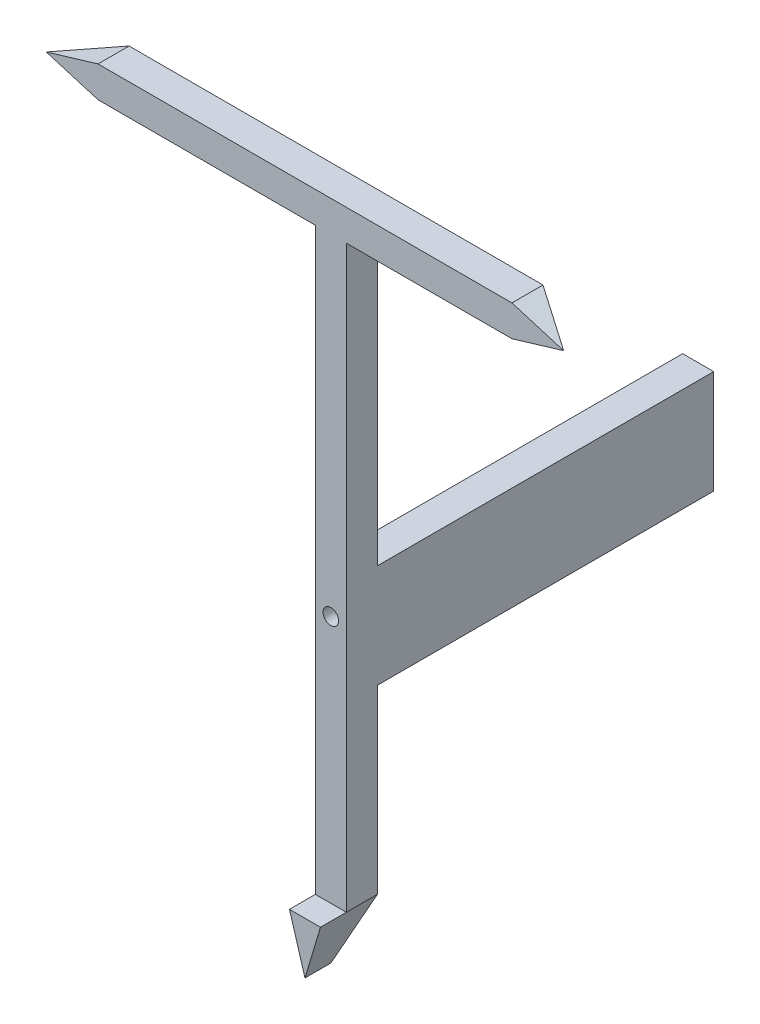
ISO-10303-21;
HEADER;
FILE_DESCRIPTION(('STEP AP214'),'2;1');
FILE_NAME('part.step','',(''),(''),'','','');
FILE_SCHEMA(('AUTOMOTIVE_DESIGN { 1 0 10303 214 1 1 1 1 }'));
ENDSEC;
DATA;
#1=APPLICATION_CONTEXT('core data for automotive mechanical design processes');
#2=APPLICATION_PROTOCOL_DEFINITION('international standard','automotive_design',2000,#1);
#3=PRODUCT_CONTEXT('',#1,'mechanical');
#4=PRODUCT('Part','Part','',(#3));
#5=PRODUCT_RELATED_PRODUCT_CATEGORY('part','',(#4));
#6=PRODUCT_DEFINITION_FORMATION('','',#4);
#7=PRODUCT_DEFINITION_CONTEXT('part definition',#1,'design');
#8=PRODUCT_DEFINITION('design','',#6,#7);
#9=PRODUCT_DEFINITION_SHAPE('','',#8);
#10=(LENGTH_UNIT() NAMED_UNIT(*) SI_UNIT(.MILLI.,.METRE.));
#11=(NAMED_UNIT(*) PLANE_ANGLE_UNIT() SI_UNIT($,.RADIAN.));
#12=(NAMED_UNIT(*) SI_UNIT($,.STERADIAN.) SOLID_ANGLE_UNIT());
#13=UNCERTAINTY_MEASURE_WITH_UNIT(LENGTH_MEASURE(1.E-05),#10,'distance_accuracy_value','');
#14=(GEOMETRIC_REPRESENTATION_CONTEXT(3) GLOBAL_UNCERTAINTY_ASSIGNED_CONTEXT((#13)) GLOBAL_UNIT_ASSIGNED_CONTEXT((#10,
#11,#12)) REPRESENTATION_CONTEXT('',''));
#15=CARTESIAN_POINT('',(0.,0.,0.));
#16=DIRECTION('',(0.,0.,1.));
#17=DIRECTION('',(1.,0.,0.));
#18=AXIS2_PLACEMENT_3D('',#15,#16,#17);
#19=CARTESIAN_POINT('',(0.,0.,-7.62));
#20=DIRECTION('',(0.,0.,-1.));
#21=DIRECTION('',(-1.,0.,0.));
#22=AXIS2_PLACEMENT_3D('',#19,#20,#21);
#23=PLANE('',#22);
#24=DIRECTION('',(0.,1.,0.));
#25=VECTOR('',#24,1.);
#26=CARTESIAN_POINT('',(10.16,-146.05,-7.62));
#27=LINE('',#26,#25);
#28=CARTESIAN_POINT('',(10.16,-76.2,-7.62));
#29=VERTEX_POINT('',#28);
#30=CARTESIAN_POINT('',(10.16,-3.81000000000001,-7.62));
#31=VERTEX_POINT('',#30);
#32=EDGE_CURVE('E120',#29,#31,#27,.T.);
#33=ORIENTED_EDGE('',*,*,#32,.F.);
#34=DIRECTION('',(-1.,0.,0.));
#35=VECTOR('',#34,1.);
#36=CARTESIAN_POINT('',(96.5293377304701,-76.2,-7.62));
#37=LINE('',#36,#35);
#38=CARTESIAN_POINT('',(2.54000000000001,-76.2,-7.62));
#39=VERTEX_POINT('',#38);
#40=EDGE_CURVE('E372',#29,#39,#37,.T.);
#41=ORIENTED_EDGE('',*,*,#40,.T.);
#42=DIRECTION('',(0.,-1.,0.));
#43=VECTOR('',#42,1.);
#44=CARTESIAN_POINT('',(2.54000000000001,-146.05,-7.62));
#45=LINE('',#44,#43);
#46=CARTESIAN_POINT('',(2.54000000000001,-3.81000000000001,-7.62));
#47=VERTEX_POINT('',#46);
#48=EDGE_CURVE('E134',#47,#39,#45,.T.);
#49=ORIENTED_EDGE('',*,*,#48,.F.);
#50=DIRECTION('',(1.,0.,0.));
#51=VECTOR('',#50,1.);
#52=CARTESIAN_POINT('',(2.54000000000001,-3.81000000000001,-7.62));
#53=LINE('',#52,#51);
#54=CARTESIAN_POINT('',(-50.8,-3.81000000000001,-7.62));
#55=VERTEX_POINT('',#54);
#56=EDGE_CURVE('E193',#55,#47,#53,.T.);
#57=ORIENTED_EDGE('',*,*,#56,.F.);
#58=DIRECTION('',(0.,1.,0.));
#59=VECTOR('',#58,1.);
#60=CARTESIAN_POINT('',(-50.8,-158.75,-7.62));
#61=LINE('',#60,#59);
#62=CARTESIAN_POINT('',(-50.8,3.80999999999999,-7.62));
#63=VERTEX_POINT('',#62);
#64=EDGE_CURVE('E307',#55,#63,#61,.T.);
#65=ORIENTED_EDGE('',*,*,#64,.T.);
#66=DIRECTION('',(-1.,0.,0.));
#67=VECTOR('',#66,1.);
#68=CARTESIAN_POINT('',(-50.8,3.80999999999999,-7.62));
#69=LINE('',#68,#67);
#70=CARTESIAN_POINT('',(50.8,3.80999999999999,-7.62));
#71=VERTEX_POINT('',#70);
#72=EDGE_CURVE('E153',#71,#63,#69,.T.);
#73=ORIENTED_EDGE('',*,*,#72,.F.);
#74=DIRECTION('',(0.,1.,0.));
#75=VECTOR('',#74,1.);
#76=CARTESIAN_POINT('',(50.8,-158.75,-7.62));
#77=LINE('',#76,#75);
#78=CARTESIAN_POINT('',(50.8,-3.81,-7.62));
#79=VERTEX_POINT('',#78);
#80=EDGE_CURVE('E150',#79,#71,#77,.T.);
#81=ORIENTED_EDGE('',*,*,#80,.F.);
#82=DIRECTION('',(1.,0.,0.));
#83=VECTOR('',#82,1.);
#84=CARTESIAN_POINT('',(50.8,-3.81,-7.62));
#85=LINE('',#84,#83);
#86=EDGE_CURVE('E139',#31,#79,#85,.T.);
#87=ORIENTED_EDGE('',*,*,#86,.F.);
#88=EDGE_LOOP('',(#33,#41,#49,#57,#65,#73,#81,#87));
#89=FACE_BOUND('',#88,.T.);
#90=ADVANCED_FACE('F45',(#89),#23,.T.);
#91=CARTESIAN_POINT('',(0.,0.,0.));
#92=DIRECTION('',(0.,0.,-1.));
#93=DIRECTION('',(-1.,0.,0.));
#94=AXIS2_PLACEMENT_3D('',#91,#92,#93);
#95=PLANE('',#94);
#96=CARTESIAN_POINT('',(6.35000000000001,-85.09,0.));
#97=DIRECTION('',(0.,0.,1.));
#98=DIRECTION('',(1.,0.,0.));
#99=AXIS2_PLACEMENT_3D('',#96,#97,#98);
#100=CIRCLE('',#99,1.905);
#101=CARTESIAN_POINT('',(8.25500000000001,-85.09,0.));
#102=VERTEX_POINT('',#101);
#103=EDGE_CURVE('E166',#102,#102,#100,.T.);
#104=ORIENTED_EDGE('',*,*,#103,.F.);
#105=EDGE_LOOP('',(#104));
#106=FACE_BOUND('',#105,.T.);
#107=DIRECTION('',(-1.,0.,0.));
#108=VECTOR('',#107,1.);
#109=CARTESIAN_POINT('',(2.54000000000001,-146.05,0.));
#110=LINE('',#109,#108);
#111=CARTESIAN_POINT('',(10.16,-146.05,0.));
#112=VERTEX_POINT('',#111);
#113=CARTESIAN_POINT('',(2.54000000000001,-146.05,0.));
#114=VERTEX_POINT('',#113);
#115=EDGE_CURVE('E301',#112,#114,#110,.T.);
#116=ORIENTED_EDGE('',*,*,#115,.F.);
#117=DIRECTION('',(0.,1.,0.));
#118=VECTOR('',#117,1.);
#119=CARTESIAN_POINT('',(10.16,-146.05,0.));
#120=LINE('',#119,#118);
#121=CARTESIAN_POINT('',(10.16,-3.81000000000001,0.));
#122=VERTEX_POINT('',#121);
#123=EDGE_CURVE('E174',#112,#122,#120,.T.);
#124=ORIENTED_EDGE('',*,*,#123,.T.);
#125=DIRECTION('',(1.,0.,0.));
#126=VECTOR('',#125,1.);
#127=CARTESIAN_POINT('',(50.8,-3.81,0.));
#128=LINE('',#127,#126);
#129=CARTESIAN_POINT('',(50.8,-3.81,0.));
#130=VERTEX_POINT('',#129);
#131=EDGE_CURVE('E141',#122,#130,#128,.T.);
#132=ORIENTED_EDGE('',*,*,#131,.T.);
#133=DIRECTION('',(0.957826285221151,0.287347885566347,0.));
#134=VECTOR('',#133,1.);
#135=CARTESIAN_POINT('',(63.5,0.,0.));
#136=LINE('',#135,#134);
#137=CARTESIAN_POINT('',(63.5,0.,0.));
#138=VERTEX_POINT('',#137);
#139=EDGE_CURVE('E179',#130,#138,#136,.T.);
#140=ORIENTED_EDGE('',*,*,#139,.T.);
#141=DIRECTION('',(-0.957826285221152,0.287347885566343,0.));
#142=VECTOR('',#141,1.);
#143=CARTESIAN_POINT('',(50.8,3.80999999999999,0.));
#144=LINE('',#143,#142);
#145=CARTESIAN_POINT('',(50.8,3.80999999999999,0.));
#146=VERTEX_POINT('',#145);
#147=EDGE_CURVE('E183',#138,#146,#144,.T.);
#148=ORIENTED_EDGE('',*,*,#147,.T.);
#149=DIRECTION('',(-1.,0.,0.));
#150=VECTOR('',#149,1.);
#151=CARTESIAN_POINT('',(-50.8,3.80999999999999,0.));
#152=LINE('',#151,#150);
#153=CARTESIAN_POINT('',(-50.8,3.80999999999999,0.));
#154=VERTEX_POINT('',#153);
#155=EDGE_CURVE('E187',#146,#154,#152,.T.);
#156=ORIENTED_EDGE('',*,*,#155,.T.);
#157=DIRECTION('',(-0.957826285221152,-0.287347885566344,0.));
#158=VECTOR('',#157,1.);
#159=CARTESIAN_POINT('',(-63.5,0.,0.));
#160=LINE('',#159,#158);
#161=CARTESIAN_POINT('',(-63.5,0.,0.));
#162=VERTEX_POINT('',#161);
#163=EDGE_CURVE('E190',#154,#162,#160,.T.);
#164=ORIENTED_EDGE('',*,*,#163,.T.);
#165=DIRECTION('',(0.957826285221151,-0.287347885566346,0.));
#166=VECTOR('',#165,1.);
#167=CARTESIAN_POINT('',(-50.8,-3.81000000000001,0.));
#168=LINE('',#167,#166);
#169=CARTESIAN_POINT('',(-50.8,-3.81000000000001,0.));
#170=VERTEX_POINT('',#169);
#171=EDGE_CURVE('E161',#162,#170,#168,.T.);
#172=ORIENTED_EDGE('',*,*,#171,.T.);
#173=DIRECTION('',(1.,0.,0.));
#174=VECTOR('',#173,1.);
#175=CARTESIAN_POINT('',(2.54000000000001,-3.81000000000001,0.));
#176=LINE('',#175,#174);
#177=CARTESIAN_POINT('',(2.54000000000001,-3.81000000000001,0.));
#178=VERTEX_POINT('',#177);
#179=EDGE_CURVE('E165',#170,#178,#176,.T.);
#180=ORIENTED_EDGE('',*,*,#179,.T.);
#181=DIRECTION('',(0.,-1.,0.));
#182=VECTOR('',#181,1.);
#183=CARTESIAN_POINT('',(2.54000000000001,-146.05,0.));
#184=LINE('',#183,#182);
#185=EDGE_CURVE('E170',#178,#114,#184,.T.);
#186=ORIENTED_EDGE('',*,*,#185,.T.);
#187=EDGE_LOOP('',(#116,#124,#132,#140,#148,#156,#164,#172,#180,#186));
#188=FACE_BOUND('',#187,.T.);
#189=ADVANCED_FACE('F219',(#106,#188),#95,.F.);
#190=CARTESIAN_POINT('',(-50.8,-3.81000000000001,-7.62));
#191=DIRECTION('',(-0.287347885566346,-0.957826285221151,0.));
#192=DIRECTION('',(0.957826285221151,-0.287347885566346,0.));
#193=AXIS2_PLACEMENT_3D('',#190,#191,#192);
#194=PLANE('',#193);
#195=DIRECTION('',(-0.8304547985374,0.249136439561221,0.49827287912244));
#196=VECTOR('',#195,1.);
#197=CARTESIAN_POINT('',(-50.8,-3.81000000000001,-7.62));
#198=LINE('',#197,#196);
#199=EDGE_CURVE('E215',#55,#162,#198,.T.);
#200=ORIENTED_EDGE('',*,*,#199,.F.);
#201=DIRECTION('',(0.,0.,1.));
#202=VECTOR('',#201,1.);
#203=CARTESIAN_POINT('',(-50.8,-3.81000000000001,-7.62));
#204=LINE('',#203,#202);
#205=EDGE_CURVE('E49',#55,#170,#204,.T.);
#206=ORIENTED_EDGE('',*,*,#205,.T.);
#207=ORIENTED_EDGE('',*,*,#171,.F.);
#208=EDGE_LOOP('',(#200,#206,#207));
#209=FACE_BOUND('',#208,.T.);
#210=ADVANCED_FACE('F47',(#209),#194,.T.);
#211=CARTESIAN_POINT('',(-63.5,0.,-7.62));
#212=DIRECTION('',(-0.287347885566344,0.957826285221152,0.));
#213=DIRECTION('',(-0.957826285221152,-0.287347885566344,0.));
#214=AXIS2_PLACEMENT_3D('',#211,#212,#213);
#215=PLANE('',#214);
#216=DIRECTION('',(0.8304547985374,0.249136439561219,-0.49827287912244));
#217=VECTOR('',#216,1.);
#218=CARTESIAN_POINT('',(-60.3468965517241,0.945931034482755,-1.89186206896552));
#219=LINE('',#218,#217);
#220=EDGE_CURVE('E72',#162,#63,#219,.T.);
#221=ORIENTED_EDGE('',*,*,#220,.F.);
#222=ORIENTED_EDGE('',*,*,#163,.F.);
#223=DIRECTION('',(0.,0.,1.));
#224=VECTOR('',#223,1.);
#225=CARTESIAN_POINT('',(-50.8,3.80999999999999,-7.62));
#226=LINE('',#225,#224);
#227=EDGE_CURVE('E11',#63,#154,#226,.T.);
#228=ORIENTED_EDGE('',*,*,#227,.F.);
#229=EDGE_LOOP('',(#221,#222,#228));
#230=FACE_BOUND('',#229,.T.);
#231=ADVANCED_FACE('F223',(#230),#215,.T.);
#232=CARTESIAN_POINT('',(-50.8,3.80999999999999,-7.62));
#233=DIRECTION('',(0.,1.,0.));
#234=DIRECTION('',(-1.,0.,0.));
#235=AXIS2_PLACEMENT_3D('',#232,#233,#234);
#236=PLANE('',#235);
#237=ORIENTED_EDGE('',*,*,#155,.F.);
#238=DIRECTION('',(0.,0.,1.));
#239=VECTOR('',#238,1.);
#240=CARTESIAN_POINT('',(50.8,3.80999999999999,-7.62));
#241=LINE('',#240,#239);
#242=EDGE_CURVE('E55',#71,#146,#241,.T.);
#243=ORIENTED_EDGE('',*,*,#242,.F.);
#244=ORIENTED_EDGE('',*,*,#72,.T.);
#245=ORIENTED_EDGE('',*,*,#227,.T.);
#246=EDGE_LOOP('',(#237,#243,#244,#245));
#247=FACE_BOUND('',#246,.T.);
#248=ADVANCED_FACE('F438',(#247),#236,.T.);
#249=CARTESIAN_POINT('',(50.8,3.80999999999999,-7.62));
#250=DIRECTION('',(0.287347885566343,0.957826285221152,0.));
#251=DIRECTION('',(-0.957826285221152,0.287347885566343,0.));
#252=AXIS2_PLACEMENT_3D('',#249,#250,#251);
#253=PLANE('',#252);
#254=DIRECTION('',(0.8304547985374,-0.249136439561218,0.49827287912244));
#255=VECTOR('',#254,1.);
#256=CARTESIAN_POINT('',(50.8,3.80999999999999,-7.62));
#257=LINE('',#256,#255);
#258=EDGE_CURVE('E225',#71,#138,#257,.T.);
#259=ORIENTED_EDGE('',*,*,#258,.F.);
#260=ORIENTED_EDGE('',*,*,#242,.T.);
#261=ORIENTED_EDGE('',*,*,#147,.F.);
#262=EDGE_LOOP('',(#259,#260,#261));
#263=FACE_BOUND('',#262,.T.);
#264=ADVANCED_FACE('F323',(#263),#253,.T.);
#265=CARTESIAN_POINT('',(63.5,0.,-7.62));
#266=DIRECTION('',(0.287347885566347,-0.957826285221151,0.));
#267=DIRECTION('',(0.957826285221151,0.287347885566347,0.));
#268=AXIS2_PLACEMENT_3D('',#265,#266,#267);
#269=PLANE('',#268);
#270=DIRECTION('',(-0.830454798537399,-0.249136439561221,-0.49827287912244));
#271=VECTOR('',#270,1.);
#272=CARTESIAN_POINT('',(60.3468965517241,-0.945931034482739,-1.89186206896551));
#273=LINE('',#272,#271);
#274=EDGE_CURVE('E231',#138,#79,#273,.T.);
#275=ORIENTED_EDGE('',*,*,#274,.F.);
#276=ORIENTED_EDGE('',*,*,#139,.F.);
#277=DIRECTION('',(0.,0.,1.));
#278=VECTOR('',#277,1.);
#279=CARTESIAN_POINT('',(50.8,-3.81,-7.62));
#280=LINE('',#279,#278);
#281=EDGE_CURVE('E144',#79,#130,#280,.T.);
#282=ORIENTED_EDGE('',*,*,#281,.F.);
#283=EDGE_LOOP('',(#275,#276,#282));
#284=FACE_BOUND('',#283,.T.);
#285=ADVANCED_FACE('F320',(#284),#269,.T.);
#286=CARTESIAN_POINT('',(50.8,-3.81,-7.62));
#287=DIRECTION('',(0.,-1.,0.));
#288=DIRECTION('',(1.,0.,0.));
#289=AXIS2_PLACEMENT_3D('',#286,#287,#288);
#290=PLANE('',#289);
#291=ORIENTED_EDGE('',*,*,#131,.F.);
#292=DIRECTION('',(0.,0.,1.));
#293=VECTOR('',#292,1.);
#294=CARTESIAN_POINT('',(10.16,-3.81000000000001,-7.62));
#295=LINE('',#294,#293);
#296=EDGE_CURVE('E124',#31,#122,#295,.T.);
#297=ORIENTED_EDGE('',*,*,#296,.F.);
#298=ORIENTED_EDGE('',*,*,#86,.T.);
#299=ORIENTED_EDGE('',*,*,#281,.T.);
#300=EDGE_LOOP('',(#291,#297,#298,#299));
#301=FACE_BOUND('',#300,.T.);
#302=ADVANCED_FACE('F138',(#301),#290,.T.);
#303=CARTESIAN_POINT('',(10.16,-146.05,-7.62));
#304=DIRECTION('',(1.,0.,0.));
#305=DIRECTION('',(0.,0.,-1.));
#306=AXIS2_PLACEMENT_3D('',#303,#304,#305);
#307=PLANE('',#306);
#308=ORIENTED_EDGE('',*,*,#123,.F.);
#309=DIRECTION('',(0.,0.,1.));
#310=VECTOR('',#309,1.);
#311=CARTESIAN_POINT('',(10.16,-146.05,-7.62));
#312=LINE('',#311,#310);
#313=CARTESIAN_POINT('',(10.16,-146.05,-7.62));
#314=VERTEX_POINT('',#313);
#315=EDGE_CURVE('E145',#314,#112,#312,.T.);
#316=ORIENTED_EDGE('',*,*,#315,.F.);
#317=CARTESIAN_POINT('',(10.16,-101.6,-7.62));
#318=VERTEX_POINT('',#317);
#319=EDGE_CURVE('E133',#314,#318,#27,.T.);
#320=ORIENTED_EDGE('',*,*,#319,.T.);
#321=DIRECTION('',(0.,0.,1.));
#322=VECTOR('',#321,1.);
#323=CARTESIAN_POINT('',(10.16,-101.6,-7.62));
#324=LINE('',#323,#322);
#325=CARTESIAN_POINT('',(10.16,-101.6,-90.17));
#326=VERTEX_POINT('',#325);
#327=EDGE_CURVE('E359',#326,#318,#324,.T.);
#328=ORIENTED_EDGE('',*,*,#327,.F.);
#329=DIRECTION('',(0.,-1.,0.));
#330=VECTOR('',#329,1.);
#331=CARTESIAN_POINT('',(10.16,-76.2,-90.17));
#332=LINE('',#331,#330);
#333=CARTESIAN_POINT('',(10.16,-76.2,-90.17));
#334=VERTEX_POINT('',#333);
#335=EDGE_CURVE('E357',#334,#326,#332,.T.);
#336=ORIENTED_EDGE('',*,*,#335,.F.);
#337=DIRECTION('',(0.,0.,-1.));
#338=VECTOR('',#337,1.);
#339=CARTESIAN_POINT('',(10.16,-76.2,-7.62));
#340=LINE('',#339,#338);
#341=EDGE_CURVE('E129',#29,#334,#340,.T.);
#342=ORIENTED_EDGE('',*,*,#341,.F.);
#343=ORIENTED_EDGE('',*,*,#32,.T.);
#344=ORIENTED_EDGE('',*,*,#296,.T.);
#345=EDGE_LOOP('',(#308,#316,#320,#328,#336,#342,#343,#344));
#346=FACE_BOUND('',#345,.T.);
#347=ADVANCED_FACE('F123',(#346),#307,.T.);
#348=CARTESIAN_POINT('',(6.35000000000001,-158.75,-7.62));
#349=DIRECTION('',(0.957826285221151,-0.287347885566345,0.));
#350=DIRECTION('',(0.287347885566346,0.957826285221152,0.));
#351=AXIS2_PLACEMENT_3D('',#348,#349,#350);
#352=PLANE('',#351);
#353=DIRECTION('',(-0.24913643956122,-0.8304547985374,0.49827287912244));
#354=VECTOR('',#353,1.);
#355=CARTESIAN_POINT('',(7.29593103448277,-155.596896551724,-1.89186206896552));
#356=LINE('',#355,#354);
#357=CARTESIAN_POINT('',(6.34999999999998,-158.75,0.));
#358=VERTEX_POINT('',#357);
#359=EDGE_CURVE('E266',#314,#358,#356,.T.);
#360=ORIENTED_EDGE('',*,*,#359,.F.);
#361=ORIENTED_EDGE('',*,*,#315,.T.);
#362=DIRECTION('',(0.,0.,-1.));
#363=VECTOR('',#362,1.);
#364=CARTESIAN_POINT('',(10.16,-146.05,6.35));
#365=LINE('',#364,#363);
#366=CARTESIAN_POINT('',(10.16,-146.05,6.35));
#367=VERTEX_POINT('',#366);
#368=EDGE_CURVE('E290',#367,#112,#365,.T.);
#369=ORIENTED_EDGE('',*,*,#368,.F.);
#370=DIRECTION('',(0.287347885566348,0.957826285221151,0.));
#371=VECTOR('',#370,1.);
#372=CARTESIAN_POINT('',(10.16,-146.05,6.35));
#373=LINE('',#372,#371);
#374=CARTESIAN_POINT('',(6.34999999999998,-158.75,6.35));
#375=VERTEX_POINT('',#374);
#376=EDGE_CURVE('E298',#375,#367,#373,.T.);
#377=ORIENTED_EDGE('',*,*,#376,.F.);
#378=DIRECTION('',(0.,0.,-1.));
#379=VECTOR('',#378,1.);
#380=CARTESIAN_POINT('',(6.34999999999998,-158.75,6.35));
#381=LINE('',#380,#379);
#382=EDGE_CURVE('E275',#375,#358,#381,.T.);
#383=ORIENTED_EDGE('',*,*,#382,.T.);
#384=EDGE_LOOP('',(#360,#361,#369,#377,#383));
#385=FACE_BOUND('',#384,.T.);
#386=ADVANCED_FACE('F331',(#385),#352,.T.);
#387=CARTESIAN_POINT('',(6.35000000000001,-158.75,-7.62));
#388=DIRECTION('',(-0.957826285221151,-0.287347885566346,0.));
#389=DIRECTION('',(0.287347885566346,-0.957826285221151,0.));
#390=AXIS2_PLACEMENT_3D('',#387,#388,#389);
#391=PLANE('',#390);
#392=DIRECTION('',(-0.24913643956122,0.8304547985374,-0.49827287912244));
#393=VECTOR('',#392,1.);
#394=CARTESIAN_POINT('',(5.40406896551725,-155.596896551724,-1.89186206896552));
#395=LINE('',#394,#393);
#396=CARTESIAN_POINT('',(2.54000000000001,-146.05,-7.62));
#397=VERTEX_POINT('',#396);
#398=EDGE_CURVE('E260',#358,#397,#395,.T.);
#399=ORIENTED_EDGE('',*,*,#398,.F.);
#400=ORIENTED_EDGE('',*,*,#382,.F.);
#401=DIRECTION('',(0.287347885566344,-0.957826285221152,0.));
#402=VECTOR('',#401,1.);
#403=CARTESIAN_POINT('',(6.34999999999998,-158.75,6.35));
#404=LINE('',#403,#402);
#405=CARTESIAN_POINT('',(2.54000000000001,-146.05,6.35));
#406=VERTEX_POINT('',#405);
#407=EDGE_CURVE('E284',#406,#375,#404,.T.);
#408=ORIENTED_EDGE('',*,*,#407,.F.);
#409=DIRECTION('',(0.,0.,-1.));
#410=VECTOR('',#409,1.);
#411=CARTESIAN_POINT('',(2.54000000000001,-146.05,6.35));
#412=LINE('',#411,#410);
#413=EDGE_CURVE('E281',#406,#114,#412,.T.);
#414=ORIENTED_EDGE('',*,*,#413,.T.);
#415=DIRECTION('',(0.,0.,1.));
#416=VECTOR('',#415,1.);
#417=CARTESIAN_POINT('',(2.54000000000001,-146.05,-7.62));
#418=LINE('',#417,#416);
#419=EDGE_CURVE('E202',#397,#114,#418,.T.);
#420=ORIENTED_EDGE('',*,*,#419,.F.);
#421=EDGE_LOOP('',(#399,#400,#408,#414,#420));
#422=FACE_BOUND('',#421,.T.);
#423=ADVANCED_FACE('F278',(#422),#391,.T.);
#424=CARTESIAN_POINT('',(2.54000000000001,-146.05,-7.62));
#425=DIRECTION('',(-1.,0.,0.));
#426=DIRECTION('',(0.,0.,1.));
#427=AXIS2_PLACEMENT_3D('',#424,#425,#426);
#428=PLANE('',#427);
#429=ORIENTED_EDGE('',*,*,#185,.F.);
#430=DIRECTION('',(0.,0.,1.));
#431=VECTOR('',#430,1.);
#432=CARTESIAN_POINT('',(2.54000000000001,-3.81000000000001,-7.62));
#433=LINE('',#432,#431);
#434=EDGE_CURVE('E110',#47,#178,#433,.T.);
#435=ORIENTED_EDGE('',*,*,#434,.F.);
#436=ORIENTED_EDGE('',*,*,#48,.T.);
#437=DIRECTION('',(0.,0.,-1.));
#438=VECTOR('',#437,1.);
#439=CARTESIAN_POINT('',(2.54000000000001,-76.2,-7.62));
#440=LINE('',#439,#438);
#441=CARTESIAN_POINT('',(2.54000000000001,-76.2,-90.17));
#442=VERTEX_POINT('',#441);
#443=EDGE_CURVE('E63',#39,#442,#440,.T.);
#444=ORIENTED_EDGE('',*,*,#443,.T.);
#445=DIRECTION('',(0.,-1.,0.));
#446=VECTOR('',#445,1.);
#447=CARTESIAN_POINT('',(2.54000000000001,-76.2,-90.17));
#448=LINE('',#447,#446);
#449=CARTESIAN_POINT('',(2.54000000000001,-101.6,-90.17));
#450=VERTEX_POINT('',#449);
#451=EDGE_CURVE('E368',#442,#450,#448,.T.);
#452=ORIENTED_EDGE('',*,*,#451,.T.);
#453=DIRECTION('',(0.,0.,1.));
#454=VECTOR('',#453,1.);
#455=CARTESIAN_POINT('',(2.54000000000001,-101.6,-7.62));
#456=LINE('',#455,#454);
#457=CARTESIAN_POINT('',(2.54000000000001,-101.6,-7.62));
#458=VERTEX_POINT('',#457);
#459=EDGE_CURVE('E252',#450,#458,#456,.T.);
#460=ORIENTED_EDGE('',*,*,#459,.T.);
#461=EDGE_CURVE('E239',#458,#397,#45,.T.);
#462=ORIENTED_EDGE('',*,*,#461,.T.);
#463=ORIENTED_EDGE('',*,*,#419,.T.);
#464=EDGE_LOOP('',(#429,#435,#436,#444,#452,#460,#462,#463));
#465=FACE_BOUND('',#464,.T.);
#466=ADVANCED_FACE('F245',(#465),#428,.T.);
#467=CARTESIAN_POINT('',(2.54000000000001,-3.81000000000001,-7.62));
#468=DIRECTION('',(0.,-1.,0.));
#469=DIRECTION('',(1.,0.,0.));
#470=AXIS2_PLACEMENT_3D('',#467,#468,#469);
#471=PLANE('',#470);
#472=ORIENTED_EDGE('',*,*,#179,.F.);
#473=ORIENTED_EDGE('',*,*,#205,.F.);
#474=ORIENTED_EDGE('',*,*,#56,.T.);
#475=ORIENTED_EDGE('',*,*,#434,.T.);
#476=EDGE_LOOP('',(#472,#473,#474,#475));
#477=FACE_BOUND('',#476,.T.);
#478=ADVANCED_FACE('F217',(#477),#471,.T.);
#479=DIRECTION('',(-1.,0.,0.));
#480=VECTOR('',#479,1.);
#481=CARTESIAN_POINT('',(96.5293377304701,-101.6,-7.62));
#482=LINE('',#481,#480);
#483=EDGE_CURVE('E381',#318,#458,#482,.T.);
#484=ORIENTED_EDGE('',*,*,#483,.F.);
#485=ORIENTED_EDGE('',*,*,#319,.F.);
#486=DIRECTION('',(1.,0.,0.));
#487=VECTOR('',#486,1.);
#488=CARTESIAN_POINT('',(-63.5,-146.05,-7.62));
#489=LINE('',#488,#487);
#490=EDGE_CURVE('E263',#397,#314,#489,.T.);
#491=ORIENTED_EDGE('',*,*,#490,.F.);
#492=ORIENTED_EDGE('',*,*,#461,.F.);
#493=EDGE_LOOP('',(#484,#485,#491,#492));
#494=FACE_BOUND('',#493,.T.);
#495=ADVANCED_FACE('F273',(#494),#23,.T.);
#496=CARTESIAN_POINT('',(6.35000000000001,-85.09,-7.62));
#497=DIRECTION('',(0.,0.,1.));
#498=DIRECTION('',(1.,0.,0.));
#499=AXIS2_PLACEMENT_3D('',#496,#497,#498);
#500=CYLINDRICAL_SURFACE('',#499,1.905);
#501=CARTESIAN_POINT('',(6.35000000000001,-85.09,-90.17));
#502=DIRECTION('',(0.,0.,1.));
#503=DIRECTION('',(1.,0.,0.));
#504=AXIS2_PLACEMENT_3D('',#501,#502,#503);
#505=CIRCLE('',#504,1.90500000000001);
#506=CARTESIAN_POINT('',(8.25500000000001,-85.09,-90.17));
#507=VERTEX_POINT('',#506);
#508=EDGE_CURVE('E595',#507,#507,#505,.T.);
#509=CARTESIAN_POINT('',(8.25500000000001,-85.09,0.));
#510=CARTESIAN_POINT('',(8.25500000000001,-85.09,-0.939270833333333));
#511=CARTESIAN_POINT('',(8.25500000000001,-85.09,-1.87854166666667));
#512=CARTESIAN_POINT('',(8.25500000000001,-85.09,-3.75708333333333));
#513=CARTESIAN_POINT('',(8.25500000000001,-85.09,-4.69635416666667));
#514=CARTESIAN_POINT('',(8.25500000000001,-85.09,-6.57489583333333));
#515=CARTESIAN_POINT('',(8.25500000000001,-85.09,-7.51416666666667));
#516=CARTESIAN_POINT('',(8.25500000000001,-85.09,-9.39270833333333));
#517=CARTESIAN_POINT('',(8.25500000000001,-85.09,-10.3319791666667));
#518=CARTESIAN_POINT('',(8.25500000000001,-85.09,-12.2105208333333));
#519=CARTESIAN_POINT('',(8.25500000000001,-85.09,-13.1497916666667));
#520=CARTESIAN_POINT('',(8.25500000000001,-85.09,-15.0283333333333));
#521=CARTESIAN_POINT('',(8.25500000000001,-85.09,-15.9676041666667));
#522=CARTESIAN_POINT('',(8.25500000000001,-85.09,-17.8461458333333));
#523=CARTESIAN_POINT('',(8.25500000000001,-85.09,-18.7854166666667));
#524=CARTESIAN_POINT('',(8.25500000000001,-85.09,-20.6639583333333));
#525=CARTESIAN_POINT('',(8.25500000000001,-85.09,-21.6032291666667));
#526=CARTESIAN_POINT('',(8.25500000000001,-85.09,-23.4817708333333));
#527=CARTESIAN_POINT('',(8.25500000000001,-85.09,-24.4210416666667));
#528=CARTESIAN_POINT('',(8.25500000000001,-85.09,-26.2995833333333));
#529=CARTESIAN_POINT('',(8.25500000000001,-85.09,-27.2388541666667));
#530=CARTESIAN_POINT('',(8.25500000000001,-85.09,-29.1173958333333));
#531=CARTESIAN_POINT('',(8.25500000000001,-85.09,-30.0566666666667));
#532=CARTESIAN_POINT('',(8.25500000000001,-85.09,-31.9352083333333));
#533=CARTESIAN_POINT('',(8.25500000000001,-85.09,-32.8744791666667));
#534=CARTESIAN_POINT('',(8.25500000000001,-85.09,-34.7530208333333));
#535=CARTESIAN_POINT('',(8.25500000000001,-85.09,-35.6922916666667));
#536=CARTESIAN_POINT('',(8.25500000000001,-85.09,-37.5708333333333));
#537=CARTESIAN_POINT('',(8.25500000000001,-85.09,-38.5101041666667));
#538=CARTESIAN_POINT('',(8.25500000000001,-85.09,-40.3886458333333));
#539=CARTESIAN_POINT('',(8.25500000000001,-85.09,-41.3279166666667));
#540=CARTESIAN_POINT('',(8.25500000000001,-85.09,-43.2064583333333));
#541=CARTESIAN_POINT('',(8.25500000000001,-85.09,-44.1457291666667));
#542=CARTESIAN_POINT('',(8.25500000000001,-85.09,-46.0242708333333));
#543=CARTESIAN_POINT('',(8.25500000000001,-85.09,-46.9635416666667));
#544=CARTESIAN_POINT('',(8.25500000000001,-85.09,-48.8420833333333));
#545=CARTESIAN_POINT('',(8.25500000000001,-85.09,-49.7813541666667));
#546=CARTESIAN_POINT('',(8.25500000000001,-85.09,-51.6598958333333));
#547=CARTESIAN_POINT('',(8.25500000000001,-85.09,-52.5991666666667));
#548=CARTESIAN_POINT('',(8.25500000000001,-85.09,-54.4777083333333));
#549=CARTESIAN_POINT('',(8.25500000000001,-85.09,-55.4169791666667));
#550=CARTESIAN_POINT('',(8.25500000000001,-85.09,-57.2955208333333));
#551=CARTESIAN_POINT('',(8.25500000000001,-85.09,-58.2347916666667));
#552=CARTESIAN_POINT('',(8.25500000000001,-85.09,-60.1133333333333));
#553=CARTESIAN_POINT('',(8.25500000000001,-85.09,-61.0526041666667));
#554=CARTESIAN_POINT('',(8.25500000000001,-85.09,-62.9311458333333));
#555=CARTESIAN_POINT('',(8.25500000000001,-85.09,-63.8704166666667));
#556=CARTESIAN_POINT('',(8.25500000000001,-85.09,-65.7489583333333));
#557=CARTESIAN_POINT('',(8.25500000000001,-85.09,-66.6882291666667));
#558=CARTESIAN_POINT('',(8.25500000000001,-85.09,-68.5667708333333));
#559=CARTESIAN_POINT('',(8.25500000000001,-85.09,-69.5060416666667));
#560=CARTESIAN_POINT('',(8.25500000000001,-85.09,-71.3845833333333));
#561=CARTESIAN_POINT('',(8.25500000000001,-85.09,-72.3238541666667));
#562=CARTESIAN_POINT('',(8.25500000000001,-85.09,-74.2023958333333));
#563=CARTESIAN_POINT('',(8.25500000000001,-85.09,-75.1416666666667));
#564=CARTESIAN_POINT('',(8.25500000000001,-85.09,-77.0202083333333));
#565=CARTESIAN_POINT('',(8.25500000000001,-85.09,-77.9594791666667));
#566=CARTESIAN_POINT('',(8.25500000000001,-85.09,-79.8380208333333));
#567=CARTESIAN_POINT('',(8.25500000000001,-85.09,-80.7772916666667));
#568=CARTESIAN_POINT('',(8.25500000000001,-85.09,-82.6558333333333));
#569=CARTESIAN_POINT('',(8.25500000000001,-85.09,-83.5951041666667));
#570=CARTESIAN_POINT('',(8.25500000000001,-85.09,-85.4736458333333));
#571=CARTESIAN_POINT('',(8.25500000000001,-85.09,-86.4129166666667));
#572=CARTESIAN_POINT('',(8.25500000000001,-85.09,-88.2914583333333));
#573=CARTESIAN_POINT('',(8.25500000000001,-85.09,-89.2307291666667));
#574=CARTESIAN_POINT('',(8.25500000000001,-85.09,-90.17));
#575=B_SPLINE_CURVE_WITH_KNOTS('',3,(#509,#510,#511,#512,#513,#514,#515,#516,#517,#518,#519,
#520,#521,#522,#523,#524,#525,#526,#527,#528,#529,#530,#531,#532,#533,#534,#535,#536,#537,#538,
#539,#540,#541,#542,#543,#544,#545,#546,#547,#548,#549,#550,#551,#552,#553,#554,#555,#556,#557,
#558,#559,#560,#561,#562,#563,#564,#565,#566,#567,#568,#569,#570,#571,#572,#573,#574),
.UNSPECIFIED.,.F.,.F.,(4,2,2,2,2,2,2,2,2,2,2,2,2,2,2,2,2,2,2,2,2,2,2,2,2,2,2,2,2,2,2,2,4),(0.,
2.8178125,5.635625,8.4534375,11.27125,14.0890625,16.906875,19.7246875,22.5425,25.3603125,
28.178125,30.9959375,33.81375,36.6315625,39.449375,42.2671875,45.085,47.9028125,50.720625,
53.5384375,56.35625,59.1740625,61.991875,64.8096875,67.6275,70.4453125,73.263125,76.0809375,
78.89875,81.7165625,84.534375,87.3521875,90.17),.UNSPECIFIED.);
#576=EDGE_CURVE('BSEAM415',#102,#507,#575,.T.);
#577=ORIENTED_EDGE('',*,*,#103,.T.);
#578=ORIENTED_EDGE('',*,*,#508,.F.);
#579=ORIENTED_EDGE('',*,*,#576,.T.);
#580=ORIENTED_EDGE('',*,*,#576,.F.);
#581=EDGE_LOOP('',(#577,#579,#578,#580));
#582=FACE_BOUND('',#581,.T.);
#583=ADVANCED_FACE('F415',(#582),#500,.F.);
#584=CARTESIAN_POINT('',(63.5,-158.75,0.));
#585=DIRECTION('',(-0.514495755427526,0.,0.857492925712544));
#586=DIRECTION('',(0.857492925712544,0.,0.514495755427526));
#587=AXIS2_PLACEMENT_3D('',#584,#585,#586);
#588=PLANE('',#587);
#589=ORIENTED_EDGE('',*,*,#258,.T.);
#590=ORIENTED_EDGE('',*,*,#274,.T.);
#591=ORIENTED_EDGE('',*,*,#80,.T.);
#592=EDGE_LOOP('',(#589,#590,#591));
#593=FACE_BOUND('',#592,.T.);
#594=ADVANCED_FACE('F314',(#593),#588,.F.);
#595=CARTESIAN_POINT('',(-63.5,-158.75,0.));
#596=DIRECTION('',(0.514495755427526,0.,0.857492925712544));
#597=DIRECTION('',(0.857492925712544,0.,-0.514495755427526));
#598=AXIS2_PLACEMENT_3D('',#595,#596,#597);
#599=PLANE('',#598);
#600=ORIENTED_EDGE('',*,*,#199,.T.);
#601=ORIENTED_EDGE('',*,*,#220,.T.);
#602=ORIENTED_EDGE('',*,*,#64,.F.);
#603=EDGE_LOOP('',(#600,#601,#602));
#604=FACE_BOUND('',#603,.T.);
#605=ADVANCED_FACE('F537',(#604),#599,.F.);
#606=CARTESIAN_POINT('',(-63.5,-158.75,0.));
#607=DIRECTION('',(0.,0.514495755427527,0.857492925712544));
#608=DIRECTION('',(0.,-0.857492925712544,0.514495755427527));
#609=AXIS2_PLACEMENT_3D('',#606,#607,#608);
#610=PLANE('',#609);
#611=ORIENTED_EDGE('',*,*,#359,.T.);
#612=ORIENTED_EDGE('',*,*,#398,.T.);
#613=ORIENTED_EDGE('',*,*,#490,.T.);
#614=EDGE_LOOP('',(#611,#612,#613));
#615=FACE_BOUND('',#614,.T.);
#616=ADVANCED_FACE('F261',(#615),#610,.F.);
#617=CARTESIAN_POINT('',(2.54000000000001,-146.05,6.35));
#618=DIRECTION('',(0.,-1.,0.));
#619=DIRECTION('',(0.,0.,-1.));
#620=AXIS2_PLACEMENT_3D('',#617,#618,#619);
#621=PLANE('',#620);
#622=ORIENTED_EDGE('',*,*,#115,.T.);
#623=ORIENTED_EDGE('',*,*,#413,.F.);
#624=DIRECTION('',(-1.,0.,0.));
#625=VECTOR('',#624,1.);
#626=CARTESIAN_POINT('',(2.54000000000001,-146.05,6.35));
#627=LINE('',#626,#625);
#628=EDGE_CURVE('E291',#367,#406,#627,.T.);
#629=ORIENTED_EDGE('',*,*,#628,.F.);
#630=ORIENTED_EDGE('',*,*,#368,.T.);
#631=EDGE_LOOP('',(#622,#623,#629,#630));
#632=FACE_BOUND('',#631,.T.);
#633=ADVANCED_FACE('F327',(#632),#621,.F.);
#634=CARTESIAN_POINT('',(0.,0.,6.35));
#635=DIRECTION('',(0.,0.,-1.));
#636=DIRECTION('',(-1.,0.,0.));
#637=AXIS2_PLACEMENT_3D('',#634,#635,#636);
#638=PLANE('',#637);
#639=ORIENTED_EDGE('',*,*,#407,.T.);
#640=ORIENTED_EDGE('',*,*,#376,.T.);
#641=ORIENTED_EDGE('',*,*,#628,.T.);
#642=EDGE_LOOP('',(#639,#640,#641));
#643=FACE_BOUND('',#642,.T.);
#644=ADVANCED_FACE('F393',(#643),#638,.F.);
#645=CARTESIAN_POINT('',(96.5293377304701,-101.6,-7.62));
#646=DIRECTION('',(0.,-1.,0.));
#647=DIRECTION('',(0.,0.,-1.));
#648=AXIS2_PLACEMENT_3D('',#645,#646,#647);
#649=PLANE('',#648);
#650=DIRECTION('',(-1.,0.,0.));
#651=VECTOR('',#650,1.);
#652=CARTESIAN_POINT('',(96.5293377304701,-101.6,-90.17));
#653=LINE('',#652,#651);
#654=EDGE_CURVE('E363',#326,#450,#653,.T.);
#655=ORIENTED_EDGE('',*,*,#654,.F.);
#656=ORIENTED_EDGE('',*,*,#327,.T.);
#657=ORIENTED_EDGE('',*,*,#483,.T.);
#658=ORIENTED_EDGE('',*,*,#459,.F.);
#659=EDGE_LOOP('',(#655,#656,#657,#658));
#660=FACE_BOUND('',#659,.T.);
#661=ADVANCED_FACE('F395',(#660),#649,.T.);
#662=CARTESIAN_POINT('',(96.5293377304701,-76.2,-90.17));
#663=DIRECTION('',(0.,0.,-1.));
#664=DIRECTION('',(-1.,0.,0.));
#665=AXIS2_PLACEMENT_3D('',#662,#663,#664);
#666=PLANE('',#665);
#667=ORIENTED_EDGE('',*,*,#508,.T.);
#668=EDGE_LOOP('',(#667));
#669=FACE_BOUND('',#668,.T.);
#670=DIRECTION('',(-1.,0.,0.));
#671=VECTOR('',#670,1.);
#672=CARTESIAN_POINT('',(96.5293377304701,-76.2,-90.17));
#673=LINE('',#672,#671);
#674=EDGE_CURVE('E364',#334,#442,#673,.T.);
#675=ORIENTED_EDGE('',*,*,#674,.F.);
#676=ORIENTED_EDGE('',*,*,#335,.T.);
#677=ORIENTED_EDGE('',*,*,#654,.T.);
#678=ORIENTED_EDGE('',*,*,#451,.F.);
#679=EDGE_LOOP('',(#675,#676,#677,#678));
#680=FACE_BOUND('',#679,.T.);
#681=ADVANCED_FACE('F367',(#669,#680),#666,.T.);
#682=CARTESIAN_POINT('',(96.5293377304701,-76.2,-7.62));
#683=DIRECTION('',(0.,1.,0.));
#684=DIRECTION('',(0.,0.,1.));
#685=AXIS2_PLACEMENT_3D('',#682,#683,#684);
#686=PLANE('',#685);
#687=ORIENTED_EDGE('',*,*,#40,.F.);
#688=ORIENTED_EDGE('',*,*,#341,.T.);
#689=ORIENTED_EDGE('',*,*,#674,.T.);
#690=ORIENTED_EDGE('',*,*,#443,.F.);
#691=EDGE_LOOP('',(#687,#688,#689,#690));
#692=FACE_BOUND('',#691,.T.);
#693=ADVANCED_FACE('F371',(#692),#686,.T.);
#694=CLOSED_SHELL('',(#90,#189,#210,#231,#248,#264,#285,#302,#347,#386,#423,#466,#478,#495,#583,
#594,#605,#616,#633,#644,#661,#681,#693));
#695=MANIFOLD_SOLID_BREP('B2',#694);
#696=ADVANCED_BREP_SHAPE_REPRESENTATION('',(#18,#695),#14);
#697=SHAPE_DEFINITION_REPRESENTATION(#9,#696);
ENDSEC;
END-ISO-10303-21;
